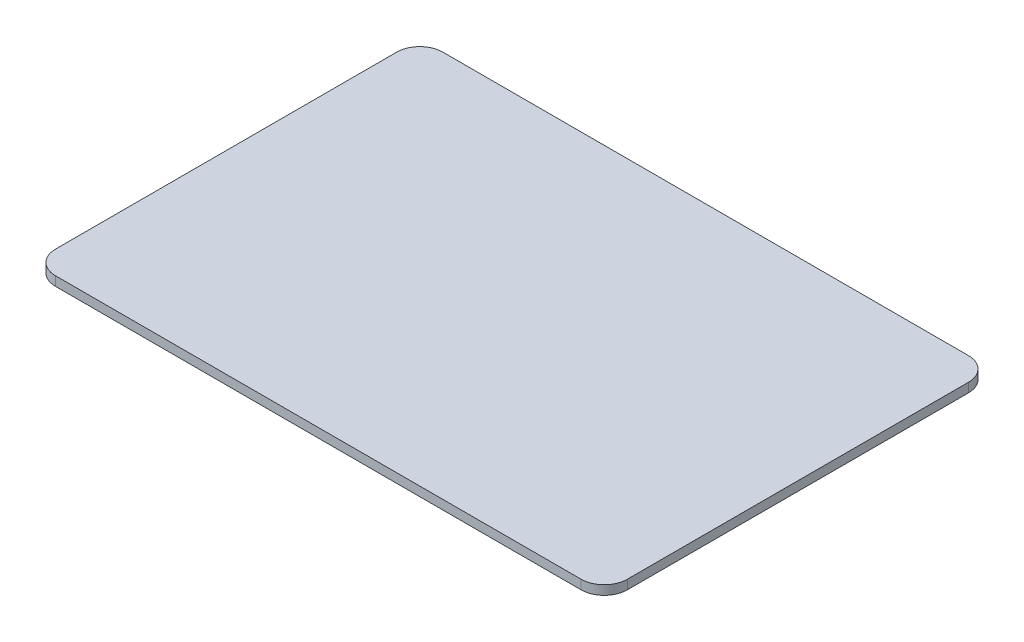
ISO-10303-21;
HEADER;
FILE_DESCRIPTION(('STEP AP214'),'2;1');
FILE_NAME('part.step','',(''),(''),'','','');
FILE_SCHEMA(('AUTOMOTIVE_DESIGN { 1 0 10303 214 1 1 1 1 }'));
ENDSEC;
DATA;
#1=APPLICATION_CONTEXT('core data for automotive mechanical design processes');
#2=APPLICATION_PROTOCOL_DEFINITION('international standard','automotive_design',2000,#1);
#3=PRODUCT_CONTEXT('',#1,'mechanical');
#4=PRODUCT('Part','Part','',(#3));
#5=PRODUCT_RELATED_PRODUCT_CATEGORY('part','',(#4));
#6=PRODUCT_DEFINITION_FORMATION('','',#4);
#7=PRODUCT_DEFINITION_CONTEXT('part definition',#1,'design');
#8=PRODUCT_DEFINITION('design','',#6,#7);
#9=PRODUCT_DEFINITION_SHAPE('','',#8);
#10=(LENGTH_UNIT() NAMED_UNIT(*) SI_UNIT(.MILLI.,.METRE.));
#11=(NAMED_UNIT(*) PLANE_ANGLE_UNIT() SI_UNIT($,.RADIAN.));
#12=(NAMED_UNIT(*) SI_UNIT($,.STERADIAN.) SOLID_ANGLE_UNIT());
#13=UNCERTAINTY_MEASURE_WITH_UNIT(LENGTH_MEASURE(1.E-05),#10,'distance_accuracy_value','');
#14=(GEOMETRIC_REPRESENTATION_CONTEXT(3) GLOBAL_UNCERTAINTY_ASSIGNED_CONTEXT((#13)) GLOBAL_UNIT_ASSIGNED_CONTEXT((#10,
#11,#12)) REPRESENTATION_CONTEXT('',''));
#15=CARTESIAN_POINT('',(0.,0.,0.));
#16=DIRECTION('',(0.,0.,1.));
#17=DIRECTION('',(1.,0.,0.));
#18=AXIS2_PLACEMENT_3D('',#15,#16,#17);
#19=CARTESIAN_POINT('',(62.,2.,-42.));
#20=DIRECTION('',(-1.,0.,0.));
#21=DIRECTION('',(0.,0.,1.));
#22=AXIS2_PLACEMENT_3D('',#19,#20,#21);
#23=PLANE('',#22);
#24=DIRECTION('',(0.,0.,-1.));
#25=VECTOR('',#24,1.);
#26=CARTESIAN_POINT('',(62.,0.,-42.));
#27=LINE('',#26,#25);
#28=CARTESIAN_POINT('',(62.,0.,37.));
#29=VERTEX_POINT('',#28);
#30=CARTESIAN_POINT('',(62.,0.,-37.));
#31=VERTEX_POINT('',#30);
#32=EDGE_CURVE('E116',#29,#31,#27,.T.);
#33=ORIENTED_EDGE('',*,*,#32,.T.);
#34=DIRECTION('',(0.,-1.,0.));
#35=VECTOR('',#34,1.);
#36=CARTESIAN_POINT('',(62.,2.,-37.));
#37=LINE('',#36,#35);
#38=CARTESIAN_POINT('',(62.,2.,-37.));
#39=VERTEX_POINT('',#38);
#40=EDGE_CURVE('E48',#31,#39,#37,.F.);
#41=ORIENTED_EDGE('',*,*,#40,.T.);
#42=DIRECTION('',(0.,0.,-1.));
#43=VECTOR('',#42,1.);
#44=CARTESIAN_POINT('',(62.,2.,-42.));
#45=LINE('',#44,#43);
#46=CARTESIAN_POINT('',(62.,2.,37.));
#47=VERTEX_POINT('',#46);
#48=EDGE_CURVE('E117',#47,#39,#45,.T.);
#49=ORIENTED_EDGE('',*,*,#48,.F.);
#50=DIRECTION('',(0.,-1.,0.));
#51=VECTOR('',#50,1.);
#52=CARTESIAN_POINT('',(62.,2.,37.));
#53=LINE('',#52,#51);
#54=EDGE_CURVE('E110',#47,#29,#53,.T.);
#55=ORIENTED_EDGE('',*,*,#54,.T.);
#56=EDGE_LOOP('',(#33,#41,#49,#55));
#57=FACE_BOUND('',#56,.T.);
#58=ADVANCED_FACE('F39',(#57),#23,.F.);
#59=CARTESIAN_POINT('',(-62.,2.,-42.));
#60=DIRECTION('',(0.,0.,1.));
#61=DIRECTION('',(1.,0.,0.));
#62=AXIS2_PLACEMENT_3D('',#59,#60,#61);
#63=PLANE('',#62);
#64=DIRECTION('',(-1.,0.,0.));
#65=VECTOR('',#64,1.);
#66=CARTESIAN_POINT('',(-62.,2.,-42.));
#67=LINE('',#66,#65);
#68=CARTESIAN_POINT('',(57.,2.,-42.));
#69=VERTEX_POINT('',#68);
#70=CARTESIAN_POINT('',(-57.,2.,-42.));
#71=VERTEX_POINT('',#70);
#72=EDGE_CURVE('E181',#69,#71,#67,.T.);
#73=ORIENTED_EDGE('',*,*,#72,.F.);
#74=DIRECTION('',(0.,-1.,0.));
#75=VECTOR('',#74,1.);
#76=CARTESIAN_POINT('',(57.,2.,-42.));
#77=LINE('',#76,#75);
#78=CARTESIAN_POINT('',(57.,0.,-42.));
#79=VERTEX_POINT('',#78);
#80=EDGE_CURVE('E171',#69,#79,#77,.T.);
#81=ORIENTED_EDGE('',*,*,#80,.T.);
#82=DIRECTION('',(-1.,0.,0.));
#83=VECTOR('',#82,1.);
#84=CARTESIAN_POINT('',(-62.,0.,-42.));
#85=LINE('',#84,#83);
#86=CARTESIAN_POINT('',(-57.,0.,-42.));
#87=VERTEX_POINT('',#86);
#88=EDGE_CURVE('E123',#79,#87,#85,.T.);
#89=ORIENTED_EDGE('',*,*,#88,.T.);
#90=DIRECTION('',(0.,-1.,0.));
#91=VECTOR('',#90,1.);
#92=CARTESIAN_POINT('',(-57.,2.,-42.));
#93=LINE('',#92,#91);
#94=EDGE_CURVE('E164',#87,#71,#93,.F.);
#95=ORIENTED_EDGE('',*,*,#94,.T.);
#96=EDGE_LOOP('',(#73,#81,#89,#95));
#97=FACE_BOUND('',#96,.T.);
#98=ADVANCED_FACE('F192',(#97),#63,.F.);
#99=CARTESIAN_POINT('',(-62.,2.,-42.));
#100=DIRECTION('',(1.,0.,0.));
#101=DIRECTION('',(0.,0.,-1.));
#102=AXIS2_PLACEMENT_3D('',#99,#100,#101);
#103=PLANE('',#102);
#104=DIRECTION('',(0.,0.,1.));
#105=VECTOR('',#104,1.);
#106=CARTESIAN_POINT('',(-62.,2.,-42.));
#107=LINE('',#106,#105);
#108=CARTESIAN_POINT('',(-62.,2.,-37.));
#109=VERTEX_POINT('',#108);
#110=CARTESIAN_POINT('',(-62.,2.,37.));
#111=VERTEX_POINT('',#110);
#112=EDGE_CURVE('E179',#109,#111,#107,.T.);
#113=ORIENTED_EDGE('',*,*,#112,.F.);
#114=DIRECTION('',(0.,-1.,0.));
#115=VECTOR('',#114,1.);
#116=CARTESIAN_POINT('',(-62.,2.,-37.));
#117=LINE('',#116,#115);
#118=CARTESIAN_POINT('',(-62.,0.,-37.));
#119=VERTEX_POINT('',#118);
#120=EDGE_CURVE('E156',#109,#119,#117,.T.);
#121=ORIENTED_EDGE('',*,*,#120,.T.);
#122=DIRECTION('',(0.,0.,1.));
#123=VECTOR('',#122,1.);
#124=CARTESIAN_POINT('',(-62.,0.,-42.));
#125=LINE('',#124,#123);
#126=CARTESIAN_POINT('',(-62.,0.,37.));
#127=VERTEX_POINT('',#126);
#128=EDGE_CURVE('E126',#119,#127,#125,.T.);
#129=ORIENTED_EDGE('',*,*,#128,.T.);
#130=DIRECTION('',(0.,-1.,0.));
#131=VECTOR('',#130,1.);
#132=CARTESIAN_POINT('',(-62.,2.,37.));
#133=LINE('',#132,#131);
#134=EDGE_CURVE('E149',#127,#111,#133,.F.);
#135=ORIENTED_EDGE('',*,*,#134,.T.);
#136=EDGE_LOOP('',(#113,#121,#129,#135));
#137=FACE_BOUND('',#136,.T.);
#138=ADVANCED_FACE('F201',(#137),#103,.F.);
#139=CARTESIAN_POINT('',(-62.,2.,42.));
#140=DIRECTION('',(0.,0.,-1.));
#141=DIRECTION('',(-1.,0.,0.));
#142=AXIS2_PLACEMENT_3D('',#139,#140,#141);
#143=PLANE('',#142);
#144=DIRECTION('',(1.,0.,0.));
#145=VECTOR('',#144,1.);
#146=CARTESIAN_POINT('',(-62.,2.,42.));
#147=LINE('',#146,#145);
#148=CARTESIAN_POINT('',(-57.,2.,42.));
#149=VERTEX_POINT('',#148);
#150=CARTESIAN_POINT('',(57.,2.,42.));
#151=VERTEX_POINT('',#150);
#152=EDGE_CURVE('E119',#149,#151,#147,.T.);
#153=ORIENTED_EDGE('',*,*,#152,.F.);
#154=DIRECTION('',(0.,-1.,0.));
#155=VECTOR('',#154,1.);
#156=CARTESIAN_POINT('',(-57.,2.,42.));
#157=LINE('',#156,#155);
#158=CARTESIAN_POINT('',(-57.,0.,42.));
#159=VERTEX_POINT('',#158);
#160=EDGE_CURVE('E141',#149,#159,#157,.T.);
#161=ORIENTED_EDGE('',*,*,#160,.T.);
#162=DIRECTION('',(1.,0.,0.));
#163=VECTOR('',#162,1.);
#164=CARTESIAN_POINT('',(-62.,0.,42.));
#165=LINE('',#164,#163);
#166=CARTESIAN_POINT('',(57.,0.,42.));
#167=VERTEX_POINT('',#166);
#168=EDGE_CURVE('E133',#159,#167,#165,.T.);
#169=ORIENTED_EDGE('',*,*,#168,.T.);
#170=DIRECTION('',(0.,-1.,0.));
#171=VECTOR('',#170,1.);
#172=CARTESIAN_POINT('',(57.,2.,42.));
#173=LINE('',#172,#171);
#174=EDGE_CURVE('E112',#167,#151,#173,.F.);
#175=ORIENTED_EDGE('',*,*,#174,.T.);
#176=EDGE_LOOP('',(#153,#161,#169,#175));
#177=FACE_BOUND('',#176,.T.);
#178=ADVANCED_FACE('F209',(#177),#143,.F.);
#179=CARTESIAN_POINT('',(0.,2.,0.));
#180=DIRECTION('',(0.,1.,0.));
#181=DIRECTION('',(0.,0.,1.));
#182=AXIS2_PLACEMENT_3D('',#179,#180,#181);
#183=PLANE('',#182);
#184=ORIENTED_EDGE('',*,*,#48,.T.);
#185=CARTESIAN_POINT('',(57.,2.,-37.));
#186=DIRECTION('',(0.,1.,0.));
#187=DIRECTION('',(0.,0.,1.));
#188=AXIS2_PLACEMENT_3D('',#185,#186,#187);
#189=CIRCLE('',#188,5.);
#190=EDGE_CURVE('E11',#39,#69,#189,.T.);
#191=ORIENTED_EDGE('',*,*,#190,.T.);
#192=ORIENTED_EDGE('',*,*,#72,.T.);
#193=CARTESIAN_POINT('',(-57.,2.,-37.));
#194=DIRECTION('',(0.,1.,0.));
#195=DIRECTION('',(0.,0.,1.));
#196=AXIS2_PLACEMENT_3D('',#193,#194,#195);
#197=CIRCLE('',#196,5.);
#198=EDGE_CURVE('E168',#71,#109,#197,.T.);
#199=ORIENTED_EDGE('',*,*,#198,.T.);
#200=ORIENTED_EDGE('',*,*,#112,.T.);
#201=CARTESIAN_POINT('',(-57.,2.,37.));
#202=DIRECTION('',(0.,1.,0.));
#203=DIRECTION('',(0.,0.,1.));
#204=AXIS2_PLACEMENT_3D('',#201,#202,#203);
#205=CIRCLE('',#204,5.);
#206=EDGE_CURVE('E153',#111,#149,#205,.T.);
#207=ORIENTED_EDGE('',*,*,#206,.T.);
#208=ORIENTED_EDGE('',*,*,#152,.T.);
#209=CARTESIAN_POINT('',(57.,2.,37.));
#210=DIRECTION('',(0.,1.,0.));
#211=DIRECTION('',(0.,0.,1.));
#212=AXIS2_PLACEMENT_3D('',#209,#210,#211);
#213=CIRCLE('',#212,5.);
#214=EDGE_CURVE('E138',#151,#47,#213,.T.);
#215=ORIENTED_EDGE('',*,*,#214,.T.);
#216=EDGE_LOOP('',(#184,#191,#192,#199,#200,#207,#208,#215));
#217=FACE_BOUND('',#216,.T.);
#218=ADVANCED_FACE('F187',(#217),#183,.T.);
#219=CARTESIAN_POINT('',(0.,0.,0.));
#220=DIRECTION('',(0.,1.,0.));
#221=DIRECTION('',(0.,0.,1.));
#222=AXIS2_PLACEMENT_3D('',#219,#220,#221);
#223=PLANE('',#222);
#224=ORIENTED_EDGE('',*,*,#88,.F.);
#225=CARTESIAN_POINT('',(57.,0.,-37.));
#226=DIRECTION('',(0.,1.,0.));
#227=DIRECTION('',(0.,0.,1.));
#228=AXIS2_PLACEMENT_3D('',#225,#226,#227);
#229=CIRCLE('',#228,5.);
#230=EDGE_CURVE('E62',#79,#31,#229,.F.);
#231=ORIENTED_EDGE('',*,*,#230,.T.);
#232=ORIENTED_EDGE('',*,*,#32,.F.);
#233=CARTESIAN_POINT('',(57.,0.,37.));
#234=DIRECTION('',(0.,1.,0.));
#235=DIRECTION('',(0.,0.,1.));
#236=AXIS2_PLACEMENT_3D('',#233,#234,#235);
#237=CIRCLE('',#236,5.);
#238=EDGE_CURVE('E106',#29,#167,#237,.F.);
#239=ORIENTED_EDGE('',*,*,#238,.T.);
#240=ORIENTED_EDGE('',*,*,#168,.F.);
#241=CARTESIAN_POINT('',(-57.,0.,37.));
#242=DIRECTION('',(0.,1.,0.));
#243=DIRECTION('',(0.,0.,1.));
#244=AXIS2_PLACEMENT_3D('',#241,#242,#243);
#245=CIRCLE('',#244,5.);
#246=EDGE_CURVE('E145',#159,#127,#245,.F.);
#247=ORIENTED_EDGE('',*,*,#246,.T.);
#248=ORIENTED_EDGE('',*,*,#128,.F.);
#249=CARTESIAN_POINT('',(-57.,0.,-37.));
#250=DIRECTION('',(0.,1.,0.));
#251=DIRECTION('',(0.,0.,1.));
#252=AXIS2_PLACEMENT_3D('',#249,#250,#251);
#253=CIRCLE('',#252,5.);
#254=EDGE_CURVE('E160',#119,#87,#253,.F.);
#255=ORIENTED_EDGE('',*,*,#254,.T.);
#256=EDGE_LOOP('',(#224,#231,#232,#239,#240,#247,#248,#255));
#257=FACE_BOUND('',#256,.T.);
#258=ADVANCED_FACE('F121',(#257),#223,.F.);
#259=CARTESIAN_POINT('',(57.,2.,37.));
#260=DIRECTION('',(0.,-1.,0.));
#261=DIRECTION('',(0.,0.,-1.));
#262=AXIS2_PLACEMENT_3D('',#259,#260,#261);
#263=CYLINDRICAL_SURFACE('',#262,5.);
#264=ORIENTED_EDGE('',*,*,#214,.F.);
#265=ORIENTED_EDGE('',*,*,#174,.F.);
#266=ORIENTED_EDGE('',*,*,#238,.F.);
#267=ORIENTED_EDGE('',*,*,#54,.F.);
#268=EDGE_LOOP('',(#264,#265,#266,#267));
#269=FACE_BOUND('',#268,.T.);
#270=ADVANCED_FACE('F109',(#269),#263,.T.);
#271=CARTESIAN_POINT('',(-57.,2.,37.));
#272=DIRECTION('',(0.,-1.,0.));
#273=DIRECTION('',(0.,0.,-1.));
#274=AXIS2_PLACEMENT_3D('',#271,#272,#273);
#275=CYLINDRICAL_SURFACE('',#274,5.);
#276=ORIENTED_EDGE('',*,*,#206,.F.);
#277=ORIENTED_EDGE('',*,*,#134,.F.);
#278=ORIENTED_EDGE('',*,*,#246,.F.);
#279=ORIENTED_EDGE('',*,*,#160,.F.);
#280=EDGE_LOOP('',(#276,#277,#278,#279));
#281=FACE_BOUND('',#280,.T.);
#282=ADVANCED_FACE('F206',(#281),#275,.T.);
#283=CARTESIAN_POINT('',(-57.,2.,-37.));
#284=DIRECTION('',(0.,-1.,0.));
#285=DIRECTION('',(0.,0.,-1.));
#286=AXIS2_PLACEMENT_3D('',#283,#284,#285);
#287=CYLINDRICAL_SURFACE('',#286,5.);
#288=ORIENTED_EDGE('',*,*,#198,.F.);
#289=ORIENTED_EDGE('',*,*,#94,.F.);
#290=ORIENTED_EDGE('',*,*,#254,.F.);
#291=ORIENTED_EDGE('',*,*,#120,.F.);
#292=EDGE_LOOP('',(#288,#289,#290,#291));
#293=FACE_BOUND('',#292,.T.);
#294=ADVANCED_FACE('F198',(#293),#287,.T.);
#295=CARTESIAN_POINT('',(57.,2.,-37.));
#296=DIRECTION('',(0.,-1.,0.));
#297=DIRECTION('',(0.,0.,-1.));
#298=AXIS2_PLACEMENT_3D('',#295,#296,#297);
#299=CYLINDRICAL_SURFACE('',#298,5.);
#300=ORIENTED_EDGE('',*,*,#190,.F.);
#301=ORIENTED_EDGE('',*,*,#40,.F.);
#302=ORIENTED_EDGE('',*,*,#230,.F.);
#303=ORIENTED_EDGE('',*,*,#80,.F.);
#304=EDGE_LOOP('',(#300,#301,#302,#303));
#305=FACE_BOUND('',#304,.T.);
#306=ADVANCED_FACE('F41',(#305),#299,.T.);
#307=CLOSED_SHELL('',(#58,#98,#138,#178,#218,#258,#270,#282,#294,#306));
#308=MANIFOLD_SOLID_BREP('B2',#307);
#309=ADVANCED_BREP_SHAPE_REPRESENTATION('',(#18,#308),#14);
#310=SHAPE_DEFINITION_REPRESENTATION(#9,#309);
ENDSEC;
END-ISO-10303-21;
